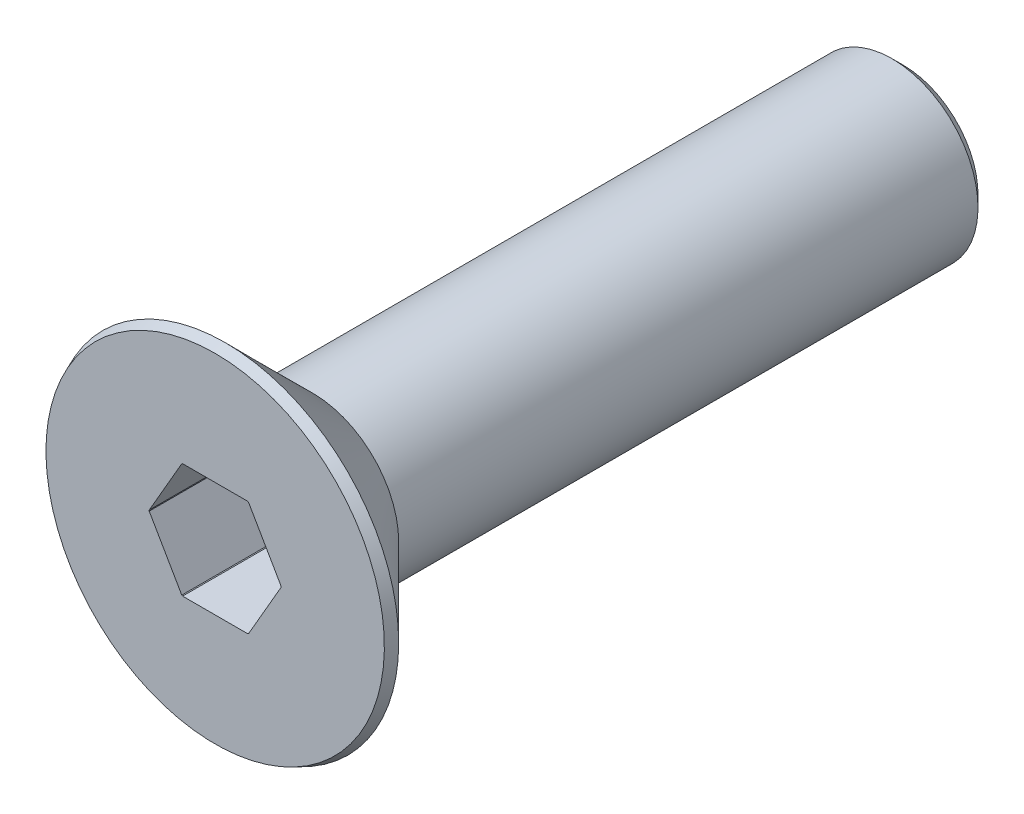
ISO-10303-21;
HEADER;
FILE_DESCRIPTION(('STEP AP214'),'2;1');
FILE_NAME('part.step','',(''),(''),'','','');
FILE_SCHEMA(('AUTOMOTIVE_DESIGN { 1 0 10303 214 1 1 1 1 }'));
ENDSEC;
DATA;
#1=APPLICATION_CONTEXT('core data for automotive mechanical design processes');
#2=APPLICATION_PROTOCOL_DEFINITION('international standard','automotive_design',2000,#1);
#3=PRODUCT_CONTEXT('',#1,'mechanical');
#4=PRODUCT('Part','Part','',(#3));
#5=PRODUCT_RELATED_PRODUCT_CATEGORY('part','',(#4));
#6=PRODUCT_DEFINITION_FORMATION('','',#4);
#7=PRODUCT_DEFINITION_CONTEXT('part definition',#1,'design');
#8=PRODUCT_DEFINITION('design','',#6,#7);
#9=PRODUCT_DEFINITION_SHAPE('','',#8);
#10=(LENGTH_UNIT() NAMED_UNIT(*) SI_UNIT(.MILLI.,.METRE.));
#11=(NAMED_UNIT(*) PLANE_ANGLE_UNIT() SI_UNIT($,.RADIAN.));
#12=(NAMED_UNIT(*) SI_UNIT($,.STERADIAN.) SOLID_ANGLE_UNIT());
#13=UNCERTAINTY_MEASURE_WITH_UNIT(LENGTH_MEASURE(1.E-05),#10,'distance_accuracy_value','');
#14=(GEOMETRIC_REPRESENTATION_CONTEXT(3) GLOBAL_UNCERTAINTY_ASSIGNED_CONTEXT((#13)) GLOBAL_UNIT_ASSIGNED_CONTEXT((#10,
#11,#12)) REPRESENTATION_CONTEXT('',''));
#15=CARTESIAN_POINT('',(0.,0.,0.));
#16=DIRECTION('',(0.,0.,1.));
#17=DIRECTION('',(1.,0.,0.));
#18=AXIS2_PLACEMENT_3D('',#15,#16,#17);
#19=CARTESIAN_POINT('',(0.,0.,-1.7));
#20=DIRECTION('',(0.,0.,1.));
#21=DIRECTION('',(0.,-1.,0.));
#22=AXIS2_PLACEMENT_3D('',#19,#20,#21);
#23=CYLINDRICAL_SURFACE('',#22,1.15);
#24=CARTESIAN_POINT('',(0.,0.,-1.7));
#25=DIRECTION('',(0.,0.,1.));
#26=DIRECTION('',(0.,-1.,0.));
#27=AXIS2_PLACEMENT_3D('',#24,#25,#26);
#28=CIRCLE('',#27,1.15);
#29=CARTESIAN_POINT('',(0.582079986494721,0.991807889322787,-1.69999999999627));
#30=VERTEX_POINT('',#29);
#31=CARTESIAN_POINT('',(0.567890834580014,0.999999999999998,-1.69999999999638));
#32=VERTEX_POINT('',#31);
#33=EDGE_CURVE('E156',#30,#32,#28,.T.);
#34=ORIENTED_EDGE('',*,*,#33,.F.);
#35=DIRECTION('',(0.,0.,1.));
#36=VECTOR('',#35,1.);
#37=CARTESIAN_POINT('',(0.58207998649445,0.991807889323259,1.));
#38=LINE('',#37,#36);
#39=CARTESIAN_POINT('',(0.582079986494721,0.991807889322788,-2.84221464964295E-11));
#40=VERTEX_POINT('',#39);
#41=EDGE_CURVE('E141',#40,#30,#38,.F.);
#42=ORIENTED_EDGE('',*,*,#41,.F.);
#43=CARTESIAN_POINT('',(0.,0.,0.));
#44=DIRECTION('',(0.,0.,-1.));
#45=DIRECTION('',(0.,1.,0.));
#46=AXIS2_PLACEMENT_3D('',#43,#44,#45);
#47=CIRCLE('',#46,1.15);
#48=CARTESIAN_POINT('',(0.56789083458,0.999999999999999,-2.8422143111273E-11));
#49=VERTEX_POINT('',#48);
#50=EDGE_CURVE('E150',#49,#40,#47,.T.);
#51=ORIENTED_EDGE('',*,*,#50,.F.);
#52=DIRECTION('',(0.,0.,-1.));
#53=VECTOR('',#52,1.);
#54=CARTESIAN_POINT('',(0.56789083458,1.,1.));
#55=LINE('',#54,#53);
#56=EDGE_CURVE('E166',#32,#49,#55,.F.);
#57=ORIENTED_EDGE('',*,*,#56,.F.);
#58=EDGE_LOOP('',(#34,#42,#51,#57));
#59=FACE_BOUND('',#58,.T.);
#60=ADVANCED_FACE('F45',(#59),#23,.F.);
#61=CARTESIAN_POINT('',(0.,0.,-1.7));
#62=DIRECTION('',(0.,0.,1.));
#63=DIRECTION('',(0.,-1.,0.));
#64=AXIS2_PLACEMENT_3D('',#61,#62,#63);
#65=CYLINDRICAL_SURFACE('',#64,1.15);
#66=CARTESIAN_POINT('',(0.,0.,-1.7));
#67=DIRECTION('',(0.,0.,1.));
#68=DIRECTION('',(0.,-1.,0.));
#69=AXIS2_PLACEMENT_3D('',#66,#67,#68);
#70=CIRCLE('',#69,1.15);
#71=CARTESIAN_POINT('',(-0.567890834580014,0.999999999999998,-1.69999999999638));
#72=VERTEX_POINT('',#71);
#73=CARTESIAN_POINT('',(-0.582079986493683,0.991807889322995,-1.6999999999964));
#74=VERTEX_POINT('',#73);
#75=EDGE_CURVE('E424',#72,#74,#70,.T.);
#76=ORIENTED_EDGE('',*,*,#75,.F.);
#77=DIRECTION('',(0.,0.,-1.));
#78=VECTOR('',#77,1.);
#79=CARTESIAN_POINT('',(-0.56789083458,1.,1.));
#80=LINE('',#79,#78);
#81=CARTESIAN_POINT('',(-0.56789083458,0.999999999999999,-2.8422143111273E-11));
#82=VERTEX_POINT('',#81);
#83=EDGE_CURVE('E159',#82,#72,#80,.T.);
#84=ORIENTED_EDGE('',*,*,#83,.F.);
#85=CARTESIAN_POINT('',(0.,0.,0.));
#86=DIRECTION('',(0.,0.,-1.));
#87=DIRECTION('',(0.,1.,0.));
#88=AXIS2_PLACEMENT_3D('',#85,#86,#87);
#89=CIRCLE('',#88,1.15);
#90=CARTESIAN_POINT('',(-0.582079986493684,0.991807889322996,-2.84221464964295E-11));
#91=VERTEX_POINT('',#90);
#92=EDGE_CURVE('E311',#91,#82,#89,.T.);
#93=ORIENTED_EDGE('',*,*,#92,.F.);
#94=DIRECTION('',(0.,0.,1.));
#95=VECTOR('',#94,1.);
#96=CARTESIAN_POINT('',(-0.582079986493761,0.991807889322862,1.));
#97=LINE('',#96,#95);
#98=EDGE_CURVE('E210',#74,#91,#97,.T.);
#99=ORIENTED_EDGE('',*,*,#98,.F.);
#100=EDGE_LOOP('',(#76,#84,#93,#99));
#101=FACE_BOUND('',#100,.T.);
#102=ADVANCED_FACE('F450',(#101),#65,.F.);
#103=CARTESIAN_POINT('',(0.,0.,-1.7));
#104=DIRECTION('',(0.,0.,1.));
#105=DIRECTION('',(0.,-1.,0.));
#106=AXIS2_PLACEMENT_3D('',#103,#104,#105);
#107=CYLINDRICAL_SURFACE('',#106,1.15);
#108=CARTESIAN_POINT('',(0.,0.,-1.7));
#109=DIRECTION('',(0.,0.,1.));
#110=DIRECTION('',(0.,-1.,0.));
#111=AXIS2_PLACEMENT_3D('',#108,#109,#110);
#112=CIRCLE('',#111,1.15);
#113=CARTESIAN_POINT('',(-1.1499708210743,0.00819211067716921,-1.69999999999643));
#114=VERTEX_POINT('',#113);
#115=CARTESIAN_POINT('',(-1.14997082107464,-0.00819211067817647,-1.6999999999963));
#116=VERTEX_POINT('',#115);
#117=EDGE_CURVE('E419',#114,#116,#112,.T.);
#118=ORIENTED_EDGE('',*,*,#117,.F.);
#119=DIRECTION('',(0.,0.,1.));
#120=VECTOR('',#119,1.);
#121=CARTESIAN_POINT('',(-1.14997082107415,0.00819211067743609,1.));
#122=LINE('',#121,#120);
#123=CARTESIAN_POINT('',(-1.1499708210743,0.00819211067717038,-2.8421711249418E-11));
#124=VERTEX_POINT('',#123);
#125=EDGE_CURVE('E214',#124,#114,#122,.F.);
#126=ORIENTED_EDGE('',*,*,#125,.F.);
#127=CARTESIAN_POINT('',(0.,0.,0.));
#128=DIRECTION('',(0.,0.,-1.));
#129=DIRECTION('',(0.,1.,0.));
#130=AXIS2_PLACEMENT_3D('',#127,#128,#129);
#131=CIRCLE('',#130,1.15);
#132=CARTESIAN_POINT('',(-1.14997082107464,-0.00819211067817531,-2.842170761139E-11));
#133=VERTEX_POINT('',#132);
#134=EDGE_CURVE('E420',#133,#124,#131,.T.);
#135=ORIENTED_EDGE('',*,*,#134,.F.);
#136=DIRECTION('',(0.,0.,1.));
#137=VECTOR('',#136,1.);
#138=CARTESIAN_POINT('',(-1.14997082107484,-0.00819211067783492,1.));
#139=LINE('',#138,#137);
#140=EDGE_CURVE('E202',#116,#133,#139,.T.);
#141=ORIENTED_EDGE('',*,*,#140,.F.);
#142=EDGE_LOOP('',(#118,#126,#135,#141));
#143=FACE_BOUND('',#142,.T.);
#144=ADVANCED_FACE('F455',(#143),#107,.F.);
#145=CARTESIAN_POINT('',(0.,0.,-1.7));
#146=DIRECTION('',(0.,0.,1.));
#147=DIRECTION('',(0.,-1.,0.));
#148=AXIS2_PLACEMENT_3D('',#145,#146,#147);
#149=CYLINDRICAL_SURFACE('',#148,1.15);
#150=CARTESIAN_POINT('',(0.,0.,-1.7));
#151=DIRECTION('',(0.,0.,1.));
#152=DIRECTION('',(0.,-1.,0.));
#153=AXIS2_PLACEMENT_3D('',#150,#151,#152);
#154=CIRCLE('',#153,1.15);
#155=CARTESIAN_POINT('',(-0.582079986494723,-0.991807889322789,-1.69999999999627));
#156=VERTEX_POINT('',#155);
#157=CARTESIAN_POINT('',(-0.567890834580013,-1.,-1.69999999999637));
#158=VERTEX_POINT('',#157);
#159=EDGE_CURVE('E177',#156,#158,#154,.T.);
#160=ORIENTED_EDGE('',*,*,#159,.F.);
#161=DIRECTION('',(0.,0.,1.));
#162=VECTOR('',#161,1.);
#163=CARTESIAN_POINT('',(-0.58207998649445,-0.991807889323259,1.));
#164=LINE('',#163,#162);
#165=CARTESIAN_POINT('',(-0.582079986494723,-0.991807889322788,-2.84212723643786E-11));
#166=VERTEX_POINT('',#165);
#167=EDGE_CURVE('E206',#166,#156,#164,.F.);
#168=ORIENTED_EDGE('',*,*,#167,.F.);
#169=CARTESIAN_POINT('',(0.,0.,0.));
#170=DIRECTION('',(0.,0.,-1.));
#171=DIRECTION('',(0.,1.,0.));
#172=AXIS2_PLACEMENT_3D('',#169,#170,#171);
#173=CIRCLE('',#172,1.15);
#174=CARTESIAN_POINT('',(-0.567890834580013,-1.,-2.84212705453646E-11));
#175=VERTEX_POINT('',#174);
#176=EDGE_CURVE('E415',#175,#166,#173,.T.);
#177=ORIENTED_EDGE('',*,*,#176,.F.);
#178=DIRECTION('',(0.,0.,1.));
#179=VECTOR('',#178,1.);
#180=CARTESIAN_POINT('',(-0.56789083458,-1.,1.));
#181=LINE('',#180,#179);
#182=EDGE_CURVE('E194',#158,#175,#181,.T.);
#183=ORIENTED_EDGE('',*,*,#182,.F.);
#184=EDGE_LOOP('',(#160,#168,#177,#183));
#185=FACE_BOUND('',#184,.T.);
#186=ADVANCED_FACE('F459',(#185),#149,.F.);
#187=CARTESIAN_POINT('',(0.,0.,-1.7));
#188=DIRECTION('',(0.,0.,1.));
#189=DIRECTION('',(0.,-1.,0.));
#190=AXIS2_PLACEMENT_3D('',#187,#188,#189);
#191=CYLINDRICAL_SURFACE('',#190,1.15);
#192=CARTESIAN_POINT('',(0.,0.,-1.7));
#193=DIRECTION('',(0.,0.,1.));
#194=DIRECTION('',(0.,-1.,0.));
#195=AXIS2_PLACEMENT_3D('',#192,#193,#194);
#196=CIRCLE('',#195,1.15);
#197=CARTESIAN_POINT('',(0.567890834580013,-1.,-1.69999999999637));
#198=VERTEX_POINT('',#197);
#199=CARTESIAN_POINT('',(0.582079986493684,-0.991807889322997,-1.6999999999964));
#200=VERTEX_POINT('',#199);
#201=EDGE_CURVE('E160',#198,#200,#196,.T.);
#202=ORIENTED_EDGE('',*,*,#201,.F.);
#203=DIRECTION('',(0.,0.,1.));
#204=VECTOR('',#203,1.);
#205=CARTESIAN_POINT('',(0.56789083458,-1.,1.));
#206=LINE('',#205,#204);
#207=CARTESIAN_POINT('',(0.567890834580013,-1.,-2.84212705453646E-11));
#208=VERTEX_POINT('',#207);
#209=EDGE_CURVE('E198',#208,#198,#206,.F.);
#210=ORIENTED_EDGE('',*,*,#209,.F.);
#211=CARTESIAN_POINT('',(0.,0.,0.));
#212=DIRECTION('',(0.,0.,-1.));
#213=DIRECTION('',(0.,1.,0.));
#214=AXIS2_PLACEMENT_3D('',#211,#212,#213);
#215=CIRCLE('',#214,1.15);
#216=CARTESIAN_POINT('',(0.582079986493684,-0.991807889322996,-2.84212723643786E-11));
#217=VERTEX_POINT('',#216);
#218=EDGE_CURVE('E168',#217,#208,#215,.T.);
#219=ORIENTED_EDGE('',*,*,#218,.F.);
#220=DIRECTION('',(0.,0.,1.));
#221=VECTOR('',#220,1.);
#222=CARTESIAN_POINT('',(0.582079986493761,-0.991807889322862,1.));
#223=LINE('',#222,#221);
#224=EDGE_CURVE('E189',#200,#217,#223,.T.);
#225=ORIENTED_EDGE('',*,*,#224,.F.);
#226=EDGE_LOOP('',(#202,#210,#219,#225));
#227=FACE_BOUND('',#226,.T.);
#228=ADVANCED_FACE('F477',(#227),#191,.F.);
#229=CARTESIAN_POINT('',(0.57735026919,1.,1.));
#230=DIRECTION('',(-0.866025403784329,-0.50000000000019,0.));
#231=DIRECTION('',(0.50000000000019,-0.866025403784329,0.));
#232=AXIS2_PLACEMENT_3D('',#229,#230,#231);
#233=PLANE('',#232);
#234=CARTESIAN_POINT('',(0.582079986491966,0.991807889327558,-1.69999999999166));
#235=CARTESIAN_POINT('',(0.605600596253279,0.951068998195986,-1.70845815070661));
#236=CARTESIAN_POINT('',(0.629197422105134,0.910198096923238,-1.71614445439344));
#237=CARTESIAN_POINT('',(0.676540507615952,0.828197467431465,-1.72965771299832));
#238=CARTESIAN_POINT('',(0.700286864543365,0.787067570738541,-1.73548329417145));
#239=CARTESIAN_POINT('',(0.747672584468559,0.704993096274919,-1.74490256972869));
#240=CARTESIAN_POINT('',(0.771310925536952,0.66405028853784,-1.74851628107554));
#241=CARTESIAN_POINT('',(0.818641326983931,0.582071628489082,-1.75336238300267));
#242=CARTESIAN_POINT('',(0.842333365384311,0.541035814244772,-1.75459561609425));
#243=CARTESIAN_POINT('',(0.88971744218507,0.458964185756152,-1.75459561609425));
#244=CARTESIAN_POINT('',(0.91340948058545,0.417928371511843,-1.75336238300267));
#245=CARTESIAN_POINT('',(0.960739882032429,0.335949711463085,-1.74851628107555));
#246=CARTESIAN_POINT('',(0.984378223100823,0.295006903726005,-1.7449025697287));
#247=CARTESIAN_POINT('',(1.03176394302602,0.212932429262382,-1.73548329417146));
#248=CARTESIAN_POINT('',(1.05551029995343,0.171802532569459,-1.72965771299833));
#249=CARTESIAN_POINT('',(1.10285338546425,0.0898019030776858,-1.71614445439345));
#250=CARTESIAN_POINT('',(1.1264502113161,0.0489310018049376,-1.70845815070663));
#251=CARTESIAN_POINT('',(1.14997082107742,0.00819211067336481,-1.69999999999168));
#252=B_SPLINE_CURVE_WITH_KNOTS('',3,(#234,#235,#236,#237,#238,#239,#240,#241,#242,#243,#244,
#245,#246,#247,#248,#249,#250,#251),.UNSPECIFIED.,.F.,.F.,(4,2,2,2,2,2,2,2,4),(0.,
0.143400587532756,0.286906802266953,0.429094334758283,0.571231534260703,0.713368733763123,
0.855556266254454,0.999062480988651,1.14246306852141),.UNSPECIFIED.);
#253=CARTESIAN_POINT('',(1.14997082107593,0.00819211067535805,-1.69999999999584));
#254=VERTEX_POINT('',#253);
#255=EDGE_CURVE('E174',#30,#254,#252,.T.);
#256=ORIENTED_EDGE('',*,*,#255,.T.);
#257=DIRECTION('',(0.,0.,1.));
#258=VECTOR('',#257,1.);
#259=CARTESIAN_POINT('',(1.14997082107445,0.0081921106773511,-1.7));
#260=LINE('',#259,#258);
#261=CARTESIAN_POINT('',(1.14997082107219,0.00819211068184096,-2.8421711249418E-11));
#262=VERTEX_POINT('',#261);
#263=EDGE_CURVE('E144',#254,#262,#260,.T.);
#264=ORIENTED_EDGE('',*,*,#263,.T.);
#265=DIRECTION('',(0.50000000000019,-0.866025403784329,0.));
#266=VECTOR('',#265,1.);
#267=CARTESIAN_POINT('',(0.57735026919,0.999999999999999,0.));
#268=LINE('',#267,#266);
#269=EDGE_CURVE('E137',#40,#262,#268,.T.);
#270=ORIENTED_EDGE('',*,*,#269,.F.);
#271=ORIENTED_EDGE('',*,*,#41,.T.);
#272=EDGE_LOOP('',(#256,#264,#270,#271));
#273=FACE_BOUND('',#272,.T.);
#274=ADVANCED_FACE('F139',(#273),#233,.T.);
#275=CARTESIAN_POINT('',(-0.57735026919,1.,1.));
#276=DIRECTION('',(0.,-1.,0.));
#277=DIRECTION('',(0.,0.,-1.));
#278=AXIS2_PLACEMENT_3D('',#275,#276,#277);
#279=PLANE('',#278);
#280=CARTESIAN_POINT('',(-0.567890834585023,0.999999999999998,-1.69999999999185));
#281=CARTESIAN_POINT('',(-0.520849615062434,0.999999999999998,-1.7084581507068));
#282=CARTESIAN_POINT('',(-0.473655963358758,0.999999999999998,-1.71614445439362));
#283=CARTESIAN_POINT('',(-0.378969792337193,0.999999999999998,-1.7296577129985));
#284=CARTESIAN_POINT('',(-0.331477078482403,0.999999999999998,-1.73548329417163));
#285=CARTESIAN_POINT('',(-0.236705638632087,0.999999999999998,-1.74490256972887));
#286=CARTESIAN_POINT('',(-0.189428956495335,0.999999999999998,-1.74851628107571));
#287=CARTESIAN_POINT('',(-0.094768153601448,0.999999999999998,-1.75336238300283));
#288=CARTESIAN_POINT('',(-0.047384076800724,0.999999999999998,-1.75459561609442));
#289=CARTESIAN_POINT('',(0.0473840768007239,0.999999999999998,-1.75459561609442));
#290=CARTESIAN_POINT('',(0.0947681536014478,0.999999999999998,-1.75336238300283));
#291=CARTESIAN_POINT('',(0.189428956495335,0.999999999999998,-1.74851628107571));
#292=CARTESIAN_POINT('',(0.236705638632087,0.999999999999998,-1.74490256972887));
#293=CARTESIAN_POINT('',(0.331477078482403,0.999999999999998,-1.73548329417163));
#294=CARTESIAN_POINT('',(0.378969792337193,0.999999999999998,-1.7296577129985));
#295=CARTESIAN_POINT('',(0.473655963358758,0.999999999999998,-1.71614445439362));
#296=CARTESIAN_POINT('',(0.520849615062434,0.999999999999998,-1.7084581507068));
#297=CARTESIAN_POINT('',(0.567890834585023,0.999999999999998,-1.69999999999185));
#298=B_SPLINE_CURVE_WITH_KNOTS('',3,(#280,#281,#282,#283,#284,#285,#286,#287,#288,#289,#290,
#291,#292,#293,#294,#295,#296,#297),.UNSPECIFIED.,.F.,.F.,(4,2,2,2,2,2,2,2,4),(0.,
0.143400587532703,0.286906802266847,0.429094334758125,0.571231534260492,0.71336873376286,
0.855556266254137,0.999062480988282,1.14246306852098),.UNSPECIFIED.);
#299=EDGE_CURVE('E223',#72,#32,#298,.T.);
#300=ORIENTED_EDGE('',*,*,#299,.T.);
#301=ORIENTED_EDGE('',*,*,#56,.T.);
#302=DIRECTION('',(1.,0.,0.));
#303=VECTOR('',#302,1.);
#304=CARTESIAN_POINT('',(-0.57735026919,0.999999999999999,0.));
#305=LINE('',#304,#303);
#306=EDGE_CURVE('E131',#82,#49,#305,.T.);
#307=ORIENTED_EDGE('',*,*,#306,.F.);
#308=ORIENTED_EDGE('',*,*,#83,.T.);
#309=EDGE_LOOP('',(#300,#301,#307,#308));
#310=FACE_BOUND('',#309,.T.);
#311=ADVANCED_FACE('F221',(#310),#279,.T.);
#312=CARTESIAN_POINT('',(-1.154700538379,0.,1.));
#313=DIRECTION('',(0.866025403784329,-0.50000000000019,0.));
#314=DIRECTION('',(0.50000000000019,0.866025403784329,0.));
#315=AXIS2_PLACEMENT_3D('',#312,#313,#314);
#316=PLANE('',#315);
#317=CARTESIAN_POINT('',(-1.14997082107672,0.00819211067297687,-1.69999999999193));
#318=CARTESIAN_POINT('',(-1.12645021131541,0.0489310018045507,-1.70845815070689));
#319=CARTESIAN_POINT('',(-1.10285338546355,0.0898019030773,-1.71614445439372));
#320=CARTESIAN_POINT('',(-1.05551029995273,0.171802532569076,-1.72965771299861));
#321=CARTESIAN_POINT('',(-1.03176394302532,0.212932429262001,-1.73548329417174));
#322=CARTESIAN_POINT('',(-0.984378223100124,0.295006903725626,-1.74490256972899));
#323=CARTESIAN_POINT('',(-0.96073988203173,0.335949711462707,-1.74851628107584));
#324=CARTESIAN_POINT('',(-0.913409480584749,0.417928371511467,-1.75336238300296));
#325=CARTESIAN_POINT('',(-0.889717442184369,0.458964185755778,-1.75459561609454));
#326=CARTESIAN_POINT('',(-0.842333365383608,0.5410358142444,-1.75459561609454));
#327=CARTESIAN_POINT('',(-0.818641326983228,0.582071628488711,-1.75336238300295));
#328=CARTESIAN_POINT('',(-0.771310925536247,0.664050288537472,-1.74851628107583));
#329=CARTESIAN_POINT('',(-0.747672584467853,0.704993096274552,-1.74490256972897));
#330=CARTESIAN_POINT('',(-0.700286864542658,0.787067570738177,-1.73548329417172));
#331=CARTESIAN_POINT('',(-0.676540507615244,0.828197467431101,-1.72965771299859));
#332=CARTESIAN_POINT('',(-0.629197422104425,0.910198096922877,-1.71614445439369));
#333=CARTESIAN_POINT('',(-0.605600596252569,0.951068998195626,-1.70845815070686));
#334=CARTESIAN_POINT('',(-0.582079986491256,0.991807889327199,-1.6999999999919));
#335=B_SPLINE_CURVE_WITH_KNOTS('',3,(#317,#318,#319,#320,#321,#322,#323,#324,#325,#326,#327,
#328,#329,#330,#331,#332,#333,#334),.UNSPECIFIED.,.F.,.F.,(4,2,2,2,2,2,2,2,4),(0.,
0.143400587532762,0.286906802266966,0.429094334758301,0.571231534260725,0.71336873376315,
0.855556266254485,0.999062480988688,1.14246306852145),.UNSPECIFIED.);
#336=EDGE_CURVE('E227',#114,#74,#335,.T.);
#337=ORIENTED_EDGE('',*,*,#336,.T.);
#338=ORIENTED_EDGE('',*,*,#98,.T.);
#339=DIRECTION('',(0.50000000000019,0.866025403784329,0.));
#340=VECTOR('',#339,1.);
#341=CARTESIAN_POINT('',(-1.154700538379,0.,0.));
#342=LINE('',#341,#340);
#343=EDGE_CURVE('E148',#124,#91,#342,.T.);
#344=ORIENTED_EDGE('',*,*,#343,.F.);
#345=ORIENTED_EDGE('',*,*,#125,.T.);
#346=EDGE_LOOP('',(#337,#338,#344,#345));
#347=FACE_BOUND('',#346,.T.);
#348=ADVANCED_FACE('F286',(#347),#316,.T.);
#349=CARTESIAN_POINT('',(-0.57735026919,-1.,1.));
#350=DIRECTION('',(0.866025403784329,0.50000000000019,0.));
#351=DIRECTION('',(-0.50000000000019,0.866025403784329,0.));
#352=AXIS2_PLACEMENT_3D('',#349,#350,#351);
#353=PLANE('',#352);
#354=CARTESIAN_POINT('',(-0.582079986491968,-0.99180788932756,-1.69999999999166));
#355=CARTESIAN_POINT('',(-0.605600596253279,-0.951068998195989,-1.70845815070661));
#356=CARTESIAN_POINT('',(-0.629197422105134,-0.910198096923243,-1.71614445439343));
#357=CARTESIAN_POINT('',(-0.676540507615949,-0.828197467431475,-1.72965771299832));
#358=CARTESIAN_POINT('',(-0.700286864543361,-0.787067570738554,-1.73548329417145));
#359=CARTESIAN_POINT('',(-0.747672584468552,-0.704993096274935,-1.74490256972869));
#360=CARTESIAN_POINT('',(-0.771310925536944,-0.664050288537858,-1.74851628107554));
#361=CARTESIAN_POINT('',(-0.818641326983921,-0.582071628489105,-1.75336238300266));
#362=CARTESIAN_POINT('',(-0.842333365384299,-0.541035814244797,-1.75459561609425));
#363=CARTESIAN_POINT('',(-0.889717442185056,-0.458964185756182,-1.75459561609425));
#364=CARTESIAN_POINT('',(-0.913409480585435,-0.417928371511874,-1.75336238300267));
#365=CARTESIAN_POINT('',(-0.960739882032412,-0.33594971146312,-1.74851628107555));
#366=CARTESIAN_POINT('',(-0.984378223100804,-0.295006903726043,-1.74490256972871));
#367=CARTESIAN_POINT('',(-1.031763943026,-0.212932429262424,-1.73548329417147));
#368=CARTESIAN_POINT('',(-1.05551029995341,-0.171802532569503,-1.72965771299834));
#369=CARTESIAN_POINT('',(-1.10285338546422,-0.0898019030777332,-1.71614445439346));
#370=CARTESIAN_POINT('',(-1.12645021131608,-0.048931001804987,-1.70845815070664));
#371=CARTESIAN_POINT('',(-1.14997082107739,-0.00819211067341607,-1.69999999999169));
#372=B_SPLINE_CURVE_WITH_KNOTS('',3,(#354,#355,#356,#357,#358,#359,#360,#361,#362,#363,#364,
#365,#366,#367,#368,#369,#370,#371),.UNSPECIFIED.,.F.,.F.,(4,2,2,2,2,2,2,2,4),(0.,
0.143400587532748,0.286906802266938,0.429094334758261,0.571231534260674,0.713368733763087,
0.85555626625441,0.9990624809886,1.14246306852135),.UNSPECIFIED.);
#373=EDGE_CURVE('E234',#156,#116,#372,.T.);
#374=ORIENTED_EDGE('',*,*,#373,.T.);
#375=ORIENTED_EDGE('',*,*,#140,.T.);
#376=DIRECTION('',(0.50000000000019,-0.866025403784329,0.));
#377=VECTOR('',#376,1.);
#378=CARTESIAN_POINT('',(-0.86602540378472,-0.500000000000415,0.));
#379=LINE('',#378,#377);
#380=EDGE_CURVE('E147',#133,#166,#379,.T.);
#381=ORIENTED_EDGE('',*,*,#380,.T.);
#382=ORIENTED_EDGE('',*,*,#167,.T.);
#383=EDGE_LOOP('',(#374,#375,#381,#382));
#384=FACE_BOUND('',#383,.T.);
#385=ADVANCED_FACE('F282',(#384),#353,.T.);
#386=CARTESIAN_POINT('',(0.57735026919,-1.,1.));
#387=DIRECTION('',(0.,1.,0.));
#388=DIRECTION('',(0.,0.,1.));
#389=AXIS2_PLACEMENT_3D('',#386,#387,#388);
#390=PLANE('',#389);
#391=CARTESIAN_POINT('',(0.567890834585023,-1.,-1.69999999999184));
#392=CARTESIAN_POINT('',(0.520849615062434,-1.,-1.7084581507068));
#393=CARTESIAN_POINT('',(0.473655963358758,-1.,-1.71614445439362));
#394=CARTESIAN_POINT('',(0.378969792337193,-1.,-1.7296577129985));
#395=CARTESIAN_POINT('',(0.331477078482403,-1.,-1.73548329417163));
#396=CARTESIAN_POINT('',(0.236705638632087,-1.,-1.74490256972886));
#397=CARTESIAN_POINT('',(0.189428956495335,-1.,-1.74851628107571));
#398=CARTESIAN_POINT('',(0.0947681536014475,-1.,-1.75336238300283));
#399=CARTESIAN_POINT('',(0.0473840768007235,-1.,-1.75459561609441));
#400=CARTESIAN_POINT('',(-0.0473840768007244,-1.,-1.75459561609441));
#401=CARTESIAN_POINT('',(-0.0947681536014484,-1.,-1.75336238300283));
#402=CARTESIAN_POINT('',(-0.189428956495336,-1.,-1.74851628107571));
#403=CARTESIAN_POINT('',(-0.236705638632088,-1.,-1.74490256972886));
#404=CARTESIAN_POINT('',(-0.331477078482404,-1.,-1.73548329417163));
#405=CARTESIAN_POINT('',(-0.378969792337194,-1.,-1.7296577129985));
#406=CARTESIAN_POINT('',(-0.473655963358759,-1.,-1.71614445439362));
#407=CARTESIAN_POINT('',(-0.520849615062435,-1.,-1.7084581507068));
#408=CARTESIAN_POINT('',(-0.567890834585024,-1.,-1.69999999999184));
#409=B_SPLINE_CURVE_WITH_KNOTS('',3,(#391,#392,#393,#394,#395,#396,#397,#398,#399,#400,#401,
#402,#403,#404,#405,#406,#407,#408),.UNSPECIFIED.,.F.,.F.,(4,2,2,2,2,2,2,2,4),(0.,
0.143400587532703,0.286906802266847,0.429094334758125,0.571231534260493,0.71336873376286,
0.855556266254138,0.999062480988282,1.14246306852099),.UNSPECIFIED.);
#410=EDGE_CURVE('E265',#198,#158,#409,.T.);
#411=ORIENTED_EDGE('',*,*,#410,.T.);
#412=ORIENTED_EDGE('',*,*,#182,.T.);
#413=DIRECTION('',(1.,0.,0.));
#414=VECTOR('',#413,1.);
#415=CARTESIAN_POINT('',(0.,-1.,0.));
#416=LINE('',#415,#414);
#417=EDGE_CURVE('E315',#175,#208,#416,.T.);
#418=ORIENTED_EDGE('',*,*,#417,.T.);
#419=ORIENTED_EDGE('',*,*,#209,.T.);
#420=EDGE_LOOP('',(#411,#412,#418,#419));
#421=FACE_BOUND('',#420,.T.);
#422=ADVANCED_FACE('F285',(#421),#390,.T.);
#423=CARTESIAN_POINT('',(1.154700538379,0.,1.));
#424=DIRECTION('',(-0.866025403784329,0.50000000000019,0.));
#425=DIRECTION('',(-0.50000000000019,-0.866025403784329,0.));
#426=AXIS2_PLACEMENT_3D('',#423,#424,#425);
#427=PLANE('',#426);
#428=CARTESIAN_POINT('',(1.14997082107675,-0.00819211067293378,-1.69999999999192));
#429=CARTESIAN_POINT('',(1.12645021131543,-0.0489310018045094,-1.70845815070688));
#430=CARTESIAN_POINT('',(1.10285338546358,-0.0898019030772605,-1.71614445439371));
#431=CARTESIAN_POINT('',(1.05551029995276,-0.17180253256904,-1.7296577129986));
#432=CARTESIAN_POINT('',(1.03176394302534,-0.212932429261967,-1.73548329417174));
#433=CARTESIAN_POINT('',(0.984378223100144,-0.295006903725596,-1.74490256972898));
#434=CARTESIAN_POINT('',(0.960739882031748,-0.335949711462678,-1.74851628107583));
#435=CARTESIAN_POINT('',(0.913409480584766,-0.417928371511442,-1.75336238300296));
#436=CARTESIAN_POINT('',(0.889717442184384,-0.458964185755755,-1.75459561609454));
#437=CARTESIAN_POINT('',(0.842333365383621,-0.541035814244381,-1.75459561609454));
#438=CARTESIAN_POINT('',(0.81864132698324,-0.582071628488694,-1.75336238300295));
#439=CARTESIAN_POINT('',(0.771310925536257,-0.664050288537457,-1.74851628107583));
#440=CARTESIAN_POINT('',(0.747672584467862,-0.704993096274539,-1.74490256972897));
#441=CARTESIAN_POINT('',(0.700286864542665,-0.787067570738168,-1.73548329417172));
#442=CARTESIAN_POINT('',(0.67654050761525,-0.828197467431095,-1.72965771299859));
#443=CARTESIAN_POINT('',(0.629197422104429,-0.910198096922874,-1.71614445439369));
#444=CARTESIAN_POINT('',(0.605600596252571,-0.951068998195625,-1.70845815070686));
#445=CARTESIAN_POINT('',(0.582079986491257,-0.9918078893272,-1.6999999999919));
#446=B_SPLINE_CURVE_WITH_KNOTS('',3,(#428,#429,#430,#431,#432,#433,#434,#435,#436,#437,#438,
#439,#440,#441,#442,#443,#444,#445),.UNSPECIFIED.,.F.,.F.,(4,2,2,2,2,2,2,2,4),(0.,
0.143400587532769,0.286906802266979,0.42909433475832,0.571231534260751,0.713368733763181,
0.855556266254523,0.999062480988733,1.1424630685215),.UNSPECIFIED.);
#447=CARTESIAN_POINT('',(1.1499708210756,-0.00819211067514478,-1.69999999999596));
#448=VERTEX_POINT('',#447);
#449=EDGE_CURVE('E193',#448,#200,#446,.T.);
#450=ORIENTED_EDGE('',*,*,#449,.T.);
#451=ORIENTED_EDGE('',*,*,#224,.T.);
#452=DIRECTION('',(0.50000000000019,0.866025403784329,0.));
#453=VECTOR('',#452,1.);
#454=CARTESIAN_POINT('',(0.866025403784031,-0.500000000000018,0.));
#455=LINE('',#454,#453);
#456=CARTESIAN_POINT('',(1.14997082107222,-0.0081921106773384,-2.842170761139E-11));
#457=VERTEX_POINT('',#456);
#458=EDGE_CURVE('E62',#217,#457,#455,.T.);
#459=ORIENTED_EDGE('',*,*,#458,.T.);
#460=DIRECTION('',(0.,0.,1.));
#461=VECTOR('',#460,1.);
#462=CARTESIAN_POINT('',(1.14997082107445,-0.00819211067735579,-1.7));
#463=LINE('',#462,#461);
#464=EDGE_CURVE('E173',#457,#448,#463,.F.);
#465=ORIENTED_EDGE('',*,*,#464,.T.);
#466=EDGE_LOOP('',(#450,#451,#459,#465));
#467=FACE_BOUND('',#466,.T.);
#468=ADVANCED_FACE('F258',(#467),#427,.T.);
#469=CARTESIAN_POINT('',(0.,0.,-1.70000000005643));
#470=DIRECTION('',(0.,0.,1.));
#471=DIRECTION('',(0.,-1.,0.));
#472=AXIS2_PLACEMENT_3D('',#469,#470,#471);
#473=CONICAL_SURFACE('',#472,1.14999999982501,1.22172999978934);
#474=CARTESIAN_POINT('',(0.,0.,-1.7));
#475=DIRECTION('',(0.,0.,1.));
#476=DIRECTION('',(0.,-1.,0.));
#477=AXIS2_PLACEMENT_3D('',#474,#475,#476);
#478=CIRCLE('',#477,1.15);
#479=EDGE_CURVE('E187',#448,#254,#478,.T.);
#480=ORIENTED_EDGE('',*,*,#479,.T.);
#481=ORIENTED_EDGE('',*,*,#255,.F.);
#482=ORIENTED_EDGE('',*,*,#33,.T.);
#483=ORIENTED_EDGE('',*,*,#299,.F.);
#484=ORIENTED_EDGE('',*,*,#75,.T.);
#485=ORIENTED_EDGE('',*,*,#336,.F.);
#486=ORIENTED_EDGE('',*,*,#117,.T.);
#487=ORIENTED_EDGE('',*,*,#373,.F.);
#488=ORIENTED_EDGE('',*,*,#159,.T.);
#489=ORIENTED_EDGE('',*,*,#410,.F.);
#490=ORIENTED_EDGE('',*,*,#201,.T.);
#491=ORIENTED_EDGE('',*,*,#449,.F.);
#492=EDGE_LOOP('',(#480,#481,#482,#483,#484,#485,#486,#487,#488,#489,#490,#491));
#493=FACE_BOUND('',#492,.T.);
#494=CARTESIAN_POINT('',(-3.41060513164848E-10,0.,-2.11856638998142));
#495=VERTEX_POINT('',#494);
#496=VERTEX_LOOP('',#495);
#497=FACE_BOUND('',#496,.T.);
#498=ADVANCED_FACE('F252',(#493,#497),#473,.F.);
#499=CARTESIAN_POINT('',(0.,0.,-1.7));
#500=DIRECTION('',(0.,0.,1.));
#501=DIRECTION('',(0.,-1.,0.));
#502=AXIS2_PLACEMENT_3D('',#499,#500,#501);
#503=CYLINDRICAL_SURFACE('',#502,1.15);
#504=ORIENTED_EDGE('',*,*,#479,.F.);
#505=ORIENTED_EDGE('',*,*,#464,.F.);
#506=CARTESIAN_POINT('',(0.,0.,0.));
#507=DIRECTION('',(0.,0.,1.));
#508=DIRECTION('',(0.,-1.,0.));
#509=AXIS2_PLACEMENT_3D('',#506,#507,#508);
#510=CIRCLE('',#509,1.15);
#511=EDGE_CURVE('E365',#457,#262,#510,.T.);
#512=ORIENTED_EDGE('',*,*,#511,.T.);
#513=ORIENTED_EDGE('',*,*,#263,.F.);
#514=EDGE_LOOP('',(#504,#505,#512,#513));
#515=FACE_BOUND('',#514,.T.);
#516=ADVANCED_FACE('F257',(#515),#503,.F.);
#517=CARTESIAN_POINT('',(0.,0.,0.));
#518=DIRECTION('',(0.,0.,-1.));
#519=DIRECTION('',(0.,1.,0.));
#520=AXIS2_PLACEMENT_3D('',#517,#518,#519);
#521=PLANE('',#520);
#522=CARTESIAN_POINT('',(0.,0.,0.));
#523=DIRECTION('',(0.,0.,-1.));
#524=DIRECTION('',(0.,1.,0.));
#525=AXIS2_PLACEMENT_3D('',#522,#523,#524);
#526=CIRCLE('',#525,2.94999944438245);
#527=CARTESIAN_POINT('',(0.,2.94999944438245,0.));
#528=VERTEX_POINT('',#527);
#529=EDGE_CURVE('E321',#528,#528,#526,.F.);
#530=ORIENTED_EDGE('',*,*,#529,.T.);
#531=EDGE_LOOP('',(#530));
#532=FACE_BOUND('',#531,.T.);
#533=ORIENTED_EDGE('',*,*,#511,.F.);
#534=ORIENTED_EDGE('',*,*,#458,.F.);
#535=ORIENTED_EDGE('',*,*,#218,.T.);
#536=ORIENTED_EDGE('',*,*,#417,.F.);
#537=ORIENTED_EDGE('',*,*,#176,.T.);
#538=ORIENTED_EDGE('',*,*,#380,.F.);
#539=ORIENTED_EDGE('',*,*,#134,.T.);
#540=ORIENTED_EDGE('',*,*,#343,.T.);
#541=ORIENTED_EDGE('',*,*,#92,.T.);
#542=ORIENTED_EDGE('',*,*,#306,.T.);
#543=ORIENTED_EDGE('',*,*,#50,.T.);
#544=ORIENTED_EDGE('',*,*,#269,.T.);
#545=EDGE_LOOP('',(#533,#534,#535,#536,#537,#538,#539,#540,#541,#542,#543,#544));
#546=FACE_BOUND('',#545,.T.);
#547=ADVANCED_FACE('F151',(#532,#546),#521,.F.);
#548=CARTESIAN_POINT('',(0.,0.,-12.));
#549=DIRECTION('',(0.,0.,-1.));
#550=DIRECTION('',(0.,1.,0.));
#551=AXIS2_PLACEMENT_3D('',#548,#549,#550);
#552=PLANE('',#551);
#553=CARTESIAN_POINT('',(0.,0.,-12.));
#554=DIRECTION('',(0.,0.,-1.));
#555=DIRECTION('',(0.,1.,0.));
#556=AXIS2_PLACEMENT_3D('',#553,#554,#555);
#557=CIRCLE('',#556,1.30000000000714);
#558=CARTESIAN_POINT('',(0.,1.30000000000713,-12.));
#559=VERTEX_POINT('',#558);
#560=EDGE_CURVE('E13',#559,#559,#557,.T.);
#561=ORIENTED_EDGE('',*,*,#560,.T.);
#562=EDGE_LOOP('',(#561));
#563=FACE_BOUND('',#562,.T.);
#564=ADVANCED_FACE('F346',(#563),#552,.T.);
#565=CARTESIAN_POINT('',(0.,0.,-0.176776724288175));
#566=DIRECTION('',(0.,0.,1.));
#567=DIRECTION('',(0.,-1.,0.));
#568=AXIS2_PLACEMENT_3D('',#565,#566,#567);
#569=CONICAL_SURFACE('',#568,3.02322277792655,0.785398000001212);
#570=CARTESIAN_POINT('',(0.,0.,-0.176776724231332));
#571=DIRECTION('',(0.,0.,1.));
#572=DIRECTION('',(0.,-1.,0.));
#573=AXIS2_PLACEMENT_3D('',#570,#571,#572);
#574=CIRCLE('',#573,3.02322277798339);
#575=CARTESIAN_POINT('',(0.,-3.02322277798339,-0.17677672423133));
#576=VERTEX_POINT('',#575);
#577=EDGE_CURVE('E324',#576,#576,#574,.F.);
#578=ORIENTED_EDGE('',*,*,#577,.T.);
#579=EDGE_LOOP('',(#578));
#580=FACE_BOUND('',#579,.T.);
#581=CARTESIAN_POINT('',(0.,0.,-1.7));
#582=DIRECTION('',(0.,0.,-1.));
#583=DIRECTION('',(0.,1.,0.));
#584=AXIS2_PLACEMENT_3D('',#581,#582,#583);
#585=CIRCLE('',#584,1.5);
#586=CARTESIAN_POINT('',(0.,1.5,-1.7));
#587=VERTEX_POINT('',#586);
#588=EDGE_CURVE('E316',#587,#587,#585,.T.);
#589=ORIENTED_EDGE('',*,*,#588,.F.);
#590=EDGE_LOOP('',(#589));
#591=FACE_BOUND('',#590,.T.);
#592=ADVANCED_FACE('F341',(#580,#591),#569,.T.);
#593=CARTESIAN_POINT('',(0.,0.,-1.7));
#594=DIRECTION('',(0.,0.,-1.));
#595=DIRECTION('',(0.,1.,0.));
#596=AXIS2_PLACEMENT_3D('',#593,#594,#595);
#597=CYLINDRICAL_SURFACE('',#596,1.5);
#598=CARTESIAN_POINT('',(0.,0.,-11.8000000000071));
#599=DIRECTION('',(0.,0.,-1.));
#600=DIRECTION('',(0.,1.,0.));
#601=AXIS2_PLACEMENT_3D('',#598,#599,#600);
#602=CIRCLE('',#601,1.5);
#603=CARTESIAN_POINT('',(0.,1.49999999999999,-11.8000000000071));
#604=VERTEX_POINT('',#603);
#605=EDGE_CURVE('E54',#604,#604,#602,.F.);
#606=ORIENTED_EDGE('',*,*,#605,.T.);
#607=EDGE_LOOP('',(#606));
#608=FACE_BOUND('',#607,.T.);
#609=ORIENTED_EDGE('',*,*,#588,.T.);
#610=EDGE_LOOP('',(#609));
#611=FACE_BOUND('',#610,.T.);
#612=ADVANCED_FACE('F329',(#608,#611),#597,.T.);
#613=CARTESIAN_POINT('',(0.,0.,0.));
#614=DIRECTION('',(0.,0.,-1.));
#615=DIRECTION('',(0.,1.,0.));
#616=AXIS2_PLACEMENT_3D('',#613,#614,#615);
#617=CONICAL_SURFACE('',#616,2.94999944438245,0.392699163359146);
#618=ORIENTED_EDGE('',*,*,#577,.F.);
#619=EDGE_LOOP('',(#618));
#620=FACE_BOUND('',#619,.T.);
#621=ORIENTED_EDGE('',*,*,#529,.F.);
#622=EDGE_LOOP('',(#621));
#623=FACE_BOUND('',#622,.T.);
#624=ADVANCED_FACE('F333',(#620,#623),#617,.T.);
#625=CARTESIAN_POINT('',(0.,0.,-11.8000000000071));
#626=DIRECTION('',(0.,0.,1.));
#627=DIRECTION('',(0.,-1.,0.));
#628=AXIS2_PLACEMENT_3D('',#625,#626,#627);
#629=CONICAL_SURFACE('',#628,1.5,0.785398163397451);
#630=ORIENTED_EDGE('',*,*,#560,.F.);
#631=EDGE_LOOP('',(#630));
#632=FACE_BOUND('',#631,.T.);
#633=ORIENTED_EDGE('',*,*,#605,.F.);
#634=EDGE_LOOP('',(#633));
#635=FACE_BOUND('',#634,.T.);
#636=ADVANCED_FACE('F47',(#632,#635),#629,.T.);
#637=CLOSED_SHELL('',(#60,#102,#144,#186,#228,#274,#311,#348,#385,#422,#468,#498,#516,#547,#564,
#592,#612,#624,#636));
#638=MANIFOLD_SOLID_BREP('B2',#637);
#639=ADVANCED_BREP_SHAPE_REPRESENTATION('',(#18,#638),#14);
#640=SHAPE_DEFINITION_REPRESENTATION(#9,#639);
ENDSEC;
END-ISO-10303-21;
